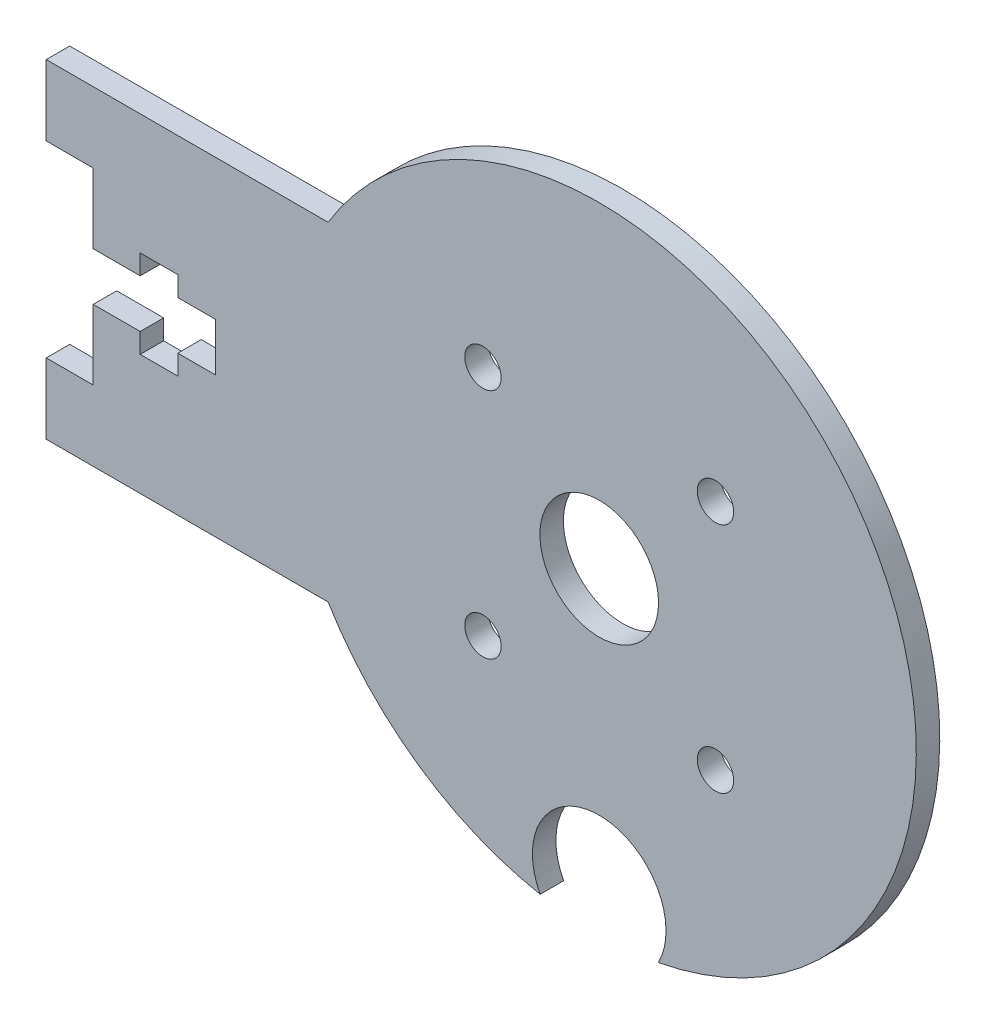
ISO-10303-21;
HEADER;
FILE_DESCRIPTION(('STEP AP214'),'2;1');
FILE_NAME('part.step','',(''),(''),'','','');
FILE_SCHEMA(('AUTOMOTIVE_DESIGN { 1 0 10303 214 1 1 1 1 }'));
ENDSEC;
DATA;
#1=APPLICATION_CONTEXT('core data for automotive mechanical design processes');
#2=APPLICATION_PROTOCOL_DEFINITION('international standard','automotive_design',2000,#1);
#3=PRODUCT_CONTEXT('',#1,'mechanical');
#4=PRODUCT('Part','Part','',(#3));
#5=PRODUCT_RELATED_PRODUCT_CATEGORY('part','',(#4));
#6=PRODUCT_DEFINITION_FORMATION('','',#4);
#7=PRODUCT_DEFINITION_CONTEXT('part definition',#1,'design');
#8=PRODUCT_DEFINITION('design','',#6,#7);
#9=PRODUCT_DEFINITION_SHAPE('','',#8);
#10=(LENGTH_UNIT() NAMED_UNIT(*) SI_UNIT(.MILLI.,.METRE.));
#11=(NAMED_UNIT(*) PLANE_ANGLE_UNIT() SI_UNIT($,.RADIAN.));
#12=(NAMED_UNIT(*) SI_UNIT($,.STERADIAN.) SOLID_ANGLE_UNIT());
#13=UNCERTAINTY_MEASURE_WITH_UNIT(LENGTH_MEASURE(1.E-05),#10,'distance_accuracy_value','');
#14=(GEOMETRIC_REPRESENTATION_CONTEXT(3) GLOBAL_UNCERTAINTY_ASSIGNED_CONTEXT((#13)) GLOBAL_UNIT_ASSIGNED_CONTEXT((#10,
#11,#12)) REPRESENTATION_CONTEXT('',''));
#15=CARTESIAN_POINT('',(0.,0.,0.));
#16=DIRECTION('',(0.,0.,1.));
#17=DIRECTION('',(1.,0.,0.));
#18=AXIS2_PLACEMENT_3D('',#15,#16,#17);
#19=CARTESIAN_POINT('',(0.,0.,2.));
#20=DIRECTION('',(0.,0.,1.));
#21=DIRECTION('',(1.,0.,0.));
#22=AXIS2_PLACEMENT_3D('',#19,#20,#21);
#23=PLANE('',#22);
#24=CARTESIAN_POINT('',(9.89949493661175,9.89949493661158,2.));
#25=DIRECTION('',(0.,0.,1.));
#26=DIRECTION('',(1.,0.,0.));
#27=AXIS2_PLACEMENT_3D('',#24,#25,#26);
#28=CIRCLE('',#27,1.55);
#29=CARTESIAN_POINT('',(11.4494949366117,9.89949493661158,2.));
#30=VERTEX_POINT('',#29);
#31=EDGE_CURVE('E428',#30,#30,#28,.T.);
#32=ORIENTED_EDGE('',*,*,#31,.F.);
#33=EDGE_LOOP('',(#32));
#34=FACE_BOUND('',#33,.T.);
#35=CARTESIAN_POINT('',(-9.89949493661168,-9.89949493661165,2.));
#36=DIRECTION('',(0.,0.,1.));
#37=DIRECTION('',(1.,0.,0.));
#38=AXIS2_PLACEMENT_3D('',#35,#36,#37);
#39=CIRCLE('',#38,1.55);
#40=CARTESIAN_POINT('',(-8.34949493661168,-9.89949493661165,2.));
#41=VERTEX_POINT('',#40);
#42=EDGE_CURVE('E440',#41,#41,#39,.T.);
#43=ORIENTED_EDGE('',*,*,#42,.F.);
#44=EDGE_LOOP('',(#43));
#45=FACE_BOUND('',#44,.T.);
#46=DIRECTION('',(1.,0.,0.));
#47=VECTOR('',#46,1.);
#48=CARTESIAN_POINT('',(-43.0867927612304,2.05,2.));
#49=LINE('',#48,#47);
#50=CARTESIAN_POINT('',(-43.0867927612304,2.05,2.));
#51=VERTEX_POINT('',#50);
#52=CARTESIAN_POINT('',(-39.0867927612304,2.05,2.));
#53=VERTEX_POINT('',#52);
#54=EDGE_CURVE('E261',#51,#53,#49,.T.);
#55=ORIENTED_EDGE('',*,*,#54,.T.);
#56=DIRECTION('',(0.,1.,0.));
#57=VECTOR('',#56,1.);
#58=CARTESIAN_POINT('',(-39.0867927612304,2.05,2.));
#59=LINE('',#58,#57);
#60=CARTESIAN_POINT('',(-39.0867927612304,3.74137062813604,2.));
#61=VERTEX_POINT('',#60);
#62=EDGE_CURVE('E137',#53,#61,#59,.T.);
#63=ORIENTED_EDGE('',*,*,#62,.T.);
#64=DIRECTION('',(1.,0.,0.));
#65=VECTOR('',#64,1.);
#66=CARTESIAN_POINT('',(-39.0867927612304,3.74137062813604,2.));
#67=LINE('',#66,#65);
#68=CARTESIAN_POINT('',(-35.8867927612304,3.74137062813604,2.));
#69=VERTEX_POINT('',#68);
#70=EDGE_CURVE('E318',#61,#69,#67,.T.);
#71=ORIENTED_EDGE('',*,*,#70,.T.);
#72=DIRECTION('',(0.,-1.,0.));
#73=VECTOR('',#72,1.);
#74=CARTESIAN_POINT('',(-35.8867927612304,3.74137062813604,2.));
#75=LINE('',#74,#73);
#76=CARTESIAN_POINT('',(-35.8867927612304,2.05,2.));
#77=VERTEX_POINT('',#76);
#78=EDGE_CURVE('E337',#69,#77,#75,.T.);
#79=ORIENTED_EDGE('',*,*,#78,.T.);
#80=DIRECTION('',(1.,0.,0.));
#81=VECTOR('',#80,1.);
#82=CARTESIAN_POINT('',(-35.8867927612304,2.05,2.));
#83=LINE('',#82,#81);
#84=CARTESIAN_POINT('',(-32.6867927612304,2.05000000000001,2.));
#85=VERTEX_POINT('',#84);
#86=EDGE_CURVE('E334',#77,#85,#83,.T.);
#87=ORIENTED_EDGE('',*,*,#86,.T.);
#88=DIRECTION('',(0.,-1.,0.));
#89=VECTOR('',#88,1.);
#90=CARTESIAN_POINT('',(-32.6867927612304,-2.05,2.));
#91=LINE('',#90,#89);
#92=CARTESIAN_POINT('',(-32.6867927612304,-2.05,2.));
#93=VERTEX_POINT('',#92);
#94=EDGE_CURVE('E336',#85,#93,#91,.T.);
#95=ORIENTED_EDGE('',*,*,#94,.T.);
#96=DIRECTION('',(-1.,0.,0.));
#97=VECTOR('',#96,1.);
#98=CARTESIAN_POINT('',(-35.8867927612304,-2.05,2.));
#99=LINE('',#98,#97);
#100=CARTESIAN_POINT('',(-35.8867927612304,-2.05,2.));
#101=VERTEX_POINT('',#100);
#102=EDGE_CURVE('E339',#93,#101,#99,.T.);
#103=ORIENTED_EDGE('',*,*,#102,.T.);
#104=DIRECTION('',(0.,-1.,0.));
#105=VECTOR('',#104,1.);
#106=CARTESIAN_POINT('',(-35.8867927612304,-3.74137062813604,2.));
#107=LINE('',#106,#105);
#108=CARTESIAN_POINT('',(-35.8867927612304,-3.74137062813604,2.));
#109=VERTEX_POINT('',#108);
#110=EDGE_CURVE('E345',#101,#109,#107,.T.);
#111=ORIENTED_EDGE('',*,*,#110,.T.);
#112=DIRECTION('',(-1.,0.,0.));
#113=VECTOR('',#112,1.);
#114=CARTESIAN_POINT('',(-39.0867927612304,-3.74137062813604,2.));
#115=LINE('',#114,#113);
#116=CARTESIAN_POINT('',(-39.0867927612304,-3.74137062813604,2.));
#117=VERTEX_POINT('',#116);
#118=EDGE_CURVE('E347',#109,#117,#115,.T.);
#119=ORIENTED_EDGE('',*,*,#118,.T.);
#120=DIRECTION('',(0.,1.,0.));
#121=VECTOR('',#120,1.);
#122=CARTESIAN_POINT('',(-39.0867927612304,-2.05,2.));
#123=LINE('',#122,#121);
#124=CARTESIAN_POINT('',(-39.0867927612304,-2.05,2.));
#125=VERTEX_POINT('',#124);
#126=EDGE_CURVE('E349',#117,#125,#123,.T.);
#127=ORIENTED_EDGE('',*,*,#126,.T.);
#128=DIRECTION('',(-1.,0.,0.));
#129=VECTOR('',#128,1.);
#130=CARTESIAN_POINT('',(-43.0867927612304,-2.05,2.));
#131=LINE('',#130,#129);
#132=CARTESIAN_POINT('',(-43.0867927612304,-2.05,2.));
#133=VERTEX_POINT('',#132);
#134=EDGE_CURVE('E351',#125,#133,#131,.T.);
#135=ORIENTED_EDGE('',*,*,#134,.T.);
#136=DIRECTION('',(0.,-1.,0.));
#137=VECTOR('',#136,1.);
#138=CARTESIAN_POINT('',(-43.0867927612304,-2.05,2.));
#139=LINE('',#138,#137);
#140=CARTESIAN_POINT('',(-43.0867927612304,-8.00000000000001,2.));
#141=VERTEX_POINT('',#140);
#142=EDGE_CURVE('E353',#133,#141,#139,.T.);
#143=ORIENTED_EDGE('',*,*,#142,.T.);
#144=DIRECTION('',(-1.,0.,0.));
#145=VECTOR('',#144,1.);
#146=CARTESIAN_POINT('',(-47.0867927612304,-8.00000000000001,2.));
#147=LINE('',#146,#145);
#148=CARTESIAN_POINT('',(-47.0867927612304,-8.00000000000001,2.));
#149=VERTEX_POINT('',#148);
#150=EDGE_CURVE('E355',#141,#149,#147,.T.);
#151=ORIENTED_EDGE('',*,*,#150,.T.);
#152=DIRECTION('',(0.,-1.,0.));
#153=VECTOR('',#152,1.);
#154=CARTESIAN_POINT('',(-47.0867927612304,-14.,2.));
#155=LINE('',#154,#153);
#156=CARTESIAN_POINT('',(-47.0867927612304,-14.,2.));
#157=VERTEX_POINT('',#156);
#158=EDGE_CURVE('E357',#149,#157,#155,.T.);
#159=ORIENTED_EDGE('',*,*,#158,.T.);
#160=DIRECTION('',(1.,0.,0.));
#161=VECTOR('',#160,1.);
#162=CARTESIAN_POINT('',(-43.0867927612304,-14.,2.));
#163=LINE('',#162,#161);
#164=CARTESIAN_POINT('',(-23.0867927612304,-14.,2.));
#165=VERTEX_POINT('',#164);
#166=EDGE_CURVE('E359',#157,#165,#163,.T.);
#167=ORIENTED_EDGE('',*,*,#166,.T.);
#168=CARTESIAN_POINT('',(0.,0.,2.));
#169=DIRECTION('',(0.,0.,1.));
#170=DIRECTION('',(1.,0.,0.));
#171=AXIS2_PLACEMENT_3D('',#168,#169,#170);
#172=CIRCLE('',#171,26.9999999999999);
#173=CARTESIAN_POINT('',(-5.02744915360052,-26.5278109727878,2.));
#174=VERTEX_POINT('',#173);
#175=EDGE_CURVE('E361',#165,#174,#172,.T.);
#176=ORIENTED_EDGE('',*,*,#175,.T.);
#177=CARTESIAN_POINT('',(0.,-23.8649464741611,2.));
#178=DIRECTION('',(0.,0.,-1.));
#179=DIRECTION('',(-1.,0.,0.));
#180=AXIS2_PLACEMENT_3D('',#177,#178,#179);
#181=CIRCLE('',#180,5.68912052342761);
#182=CARTESIAN_POINT('',(5.02744915360052,-26.5278109727878,2.));
#183=VERTEX_POINT('',#182);
#184=EDGE_CURVE('E363',#174,#183,#181,.T.);
#185=ORIENTED_EDGE('',*,*,#184,.T.);
#186=CARTESIAN_POINT('',(0.,0.,2.));
#187=DIRECTION('',(0.,0.,1.));
#188=DIRECTION('',(-1.,0.,0.));
#189=AXIS2_PLACEMENT_3D('',#186,#187,#188);
#190=CIRCLE('',#189,27.);
#191=CARTESIAN_POINT('',(-23.0867927612304,14.,2.));
#192=VERTEX_POINT('',#191);
#193=EDGE_CURVE('E365',#183,#192,#190,.T.);
#194=ORIENTED_EDGE('',*,*,#193,.T.);
#195=DIRECTION('',(-1.,0.,0.));
#196=VECTOR('',#195,1.);
#197=CARTESIAN_POINT('',(-23.0867927612304,14.,2.));
#198=LINE('',#197,#196);
#199=CARTESIAN_POINT('',(-47.0867927612304,14.,2.));
#200=VERTEX_POINT('',#199);
#201=EDGE_CURVE('E198',#192,#200,#198,.T.);
#202=ORIENTED_EDGE('',*,*,#201,.T.);
#203=DIRECTION('',(0.,-1.,0.));
#204=VECTOR('',#203,1.);
#205=CARTESIAN_POINT('',(-47.0867927612304,14.,2.));
#206=LINE('',#205,#204);
#207=CARTESIAN_POINT('',(-47.0867927612304,7.99999999999998,2.));
#208=VERTEX_POINT('',#207);
#209=EDGE_CURVE('E192',#200,#208,#206,.T.);
#210=ORIENTED_EDGE('',*,*,#209,.T.);
#211=DIRECTION('',(1.,0.,0.));
#212=VECTOR('',#211,1.);
#213=CARTESIAN_POINT('',(-47.0867927612304,7.99999999999998,2.));
#214=LINE('',#213,#212);
#215=CARTESIAN_POINT('',(-43.0867927612304,7.99999999999998,2.));
#216=VERTEX_POINT('',#215);
#217=EDGE_CURVE('E196',#208,#216,#214,.T.);
#218=ORIENTED_EDGE('',*,*,#217,.T.);
#219=DIRECTION('',(0.,-1.,0.));
#220=VECTOR('',#219,1.);
#221=CARTESIAN_POINT('',(-43.0867927612304,2.05,2.));
#222=LINE('',#221,#220);
#223=EDGE_CURVE('E52',#216,#51,#222,.T.);
#224=ORIENTED_EDGE('',*,*,#223,.T.);
#225=EDGE_LOOP('',(#55,#63,#71,#79,#87,#95,#103,#111,#119,#127,#135,#143,#151,#159,#167,#176,
#185,#194,#202,#210,#218,#224));
#226=FACE_BOUND('',#225,.T.);
#227=CARTESIAN_POINT('',(0.,0.,2.));
#228=DIRECTION('',(0.,0.,1.));
#229=DIRECTION('',(1.,0.,0.));
#230=AXIS2_PLACEMENT_3D('',#227,#228,#229);
#231=CIRCLE('',#230,5.05);
#232=CARTESIAN_POINT('',(5.05,0.,2.));
#233=VERTEX_POINT('',#232);
#234=EDGE_CURVE('E220',#233,#233,#231,.T.);
#235=ORIENTED_EDGE('',*,*,#234,.F.);
#236=EDGE_LOOP('',(#235));
#237=FACE_BOUND('',#236,.T.);
#238=CARTESIAN_POINT('',(-9.89949493661161,9.89949493661172,2.));
#239=DIRECTION('',(0.,0.,1.));
#240=DIRECTION('',(1.,0.,0.));
#241=AXIS2_PLACEMENT_3D('',#238,#239,#240);
#242=CIRCLE('',#241,1.55);
#243=CARTESIAN_POINT('',(-8.34949493661161,9.89949493661172,2.));
#244=VERTEX_POINT('',#243);
#245=EDGE_CURVE('E434',#244,#244,#242,.T.);
#246=ORIENTED_EDGE('',*,*,#245,.F.);
#247=EDGE_LOOP('',(#246));
#248=FACE_BOUND('',#247,.T.);
#249=CARTESIAN_POINT('',(9.89949493661154,-9.89949493661178,2.));
#250=DIRECTION('',(0.,0.,1.));
#251=DIRECTION('',(1.,0.,0.));
#252=AXIS2_PLACEMENT_3D('',#249,#250,#251);
#253=CIRCLE('',#252,1.55);
#254=CARTESIAN_POINT('',(11.4494949366115,-9.89949493661178,2.));
#255=VERTEX_POINT('',#254);
#256=EDGE_CURVE('E419',#255,#255,#253,.T.);
#257=ORIENTED_EDGE('',*,*,#256,.F.);
#258=EDGE_LOOP('',(#257));
#259=FACE_BOUND('',#258,.T.);
#260=ADVANCED_FACE('F35',(#34,#45,#226,#237,#248,#259),#23,.T.);
#261=CARTESIAN_POINT('',(0.,0.,0.));
#262=DIRECTION('',(0.,0.,1.));
#263=DIRECTION('',(1.,0.,0.));
#264=AXIS2_PLACEMENT_3D('',#261,#262,#263);
#265=PLANE('',#264);
#266=DIRECTION('',(1.,0.,0.));
#267=VECTOR('',#266,1.);
#268=CARTESIAN_POINT('',(-43.0867927612304,2.05,0.));
#269=LINE('',#268,#267);
#270=CARTESIAN_POINT('',(-43.0867927612304,2.05,0.));
#271=VERTEX_POINT('',#270);
#272=CARTESIAN_POINT('',(-39.0867927612304,2.05,0.));
#273=VERTEX_POINT('',#272);
#274=EDGE_CURVE('E216',#271,#273,#269,.T.);
#275=ORIENTED_EDGE('',*,*,#274,.F.);
#276=DIRECTION('',(0.,-1.,0.));
#277=VECTOR('',#276,1.);
#278=CARTESIAN_POINT('',(-43.0867927612304,2.05,0.));
#279=LINE('',#278,#277);
#280=CARTESIAN_POINT('',(-43.0867927612304,7.99999999999998,0.));
#281=VERTEX_POINT('',#280);
#282=EDGE_CURVE('E129',#281,#271,#279,.T.);
#283=ORIENTED_EDGE('',*,*,#282,.F.);
#284=DIRECTION('',(1.,0.,0.));
#285=VECTOR('',#284,1.);
#286=CARTESIAN_POINT('',(-47.0867927612304,7.99999999999998,0.));
#287=LINE('',#286,#285);
#288=CARTESIAN_POINT('',(-47.0867927612304,7.99999999999998,0.));
#289=VERTEX_POINT('',#288);
#290=EDGE_CURVE('E123',#289,#281,#287,.T.);
#291=ORIENTED_EDGE('',*,*,#290,.F.);
#292=DIRECTION('',(0.,-1.,0.));
#293=VECTOR('',#292,1.);
#294=CARTESIAN_POINT('',(-47.0867927612304,14.,0.));
#295=LINE('',#294,#293);
#296=CARTESIAN_POINT('',(-47.0867927612304,14.,0.));
#297=VERTEX_POINT('',#296);
#298=EDGE_CURVE('E206',#297,#289,#295,.T.);
#299=ORIENTED_EDGE('',*,*,#298,.F.);
#300=DIRECTION('',(-1.,0.,0.));
#301=VECTOR('',#300,1.);
#302=CARTESIAN_POINT('',(-43.0867927612304,14.,0.));
#303=LINE('',#302,#301);
#304=CARTESIAN_POINT('',(-23.0867927612304,14.,0.));
#305=VERTEX_POINT('',#304);
#306=EDGE_CURVE('E256',#305,#297,#303,.T.);
#307=ORIENTED_EDGE('',*,*,#306,.F.);
#308=CARTESIAN_POINT('',(0.,0.,0.));
#309=DIRECTION('',(0.,0.,1.));
#310=DIRECTION('',(-1.,0.,0.));
#311=AXIS2_PLACEMENT_3D('',#308,#309,#310);
#312=CIRCLE('',#311,27.);
#313=CARTESIAN_POINT('',(5.02744915360052,-26.5278109727878,0.));
#314=VERTEX_POINT('',#313);
#315=EDGE_CURVE('E253',#314,#305,#312,.T.);
#316=ORIENTED_EDGE('',*,*,#315,.F.);
#317=CARTESIAN_POINT('',(0.,-23.8649464741611,0.));
#318=DIRECTION('',(0.,0.,-1.));
#319=DIRECTION('',(-1.,0.,0.));
#320=AXIS2_PLACEMENT_3D('',#317,#318,#319);
#321=CIRCLE('',#320,5.68912052342761);
#322=CARTESIAN_POINT('',(-5.02744915360052,-26.5278109727878,0.));
#323=VERTEX_POINT('',#322);
#324=EDGE_CURVE('E251',#323,#314,#321,.T.);
#325=ORIENTED_EDGE('',*,*,#324,.F.);
#326=CARTESIAN_POINT('',(0.,0.,0.));
#327=DIRECTION('',(0.,0.,1.));
#328=DIRECTION('',(1.,0.,0.));
#329=AXIS2_PLACEMENT_3D('',#326,#327,#328);
#330=CIRCLE('',#329,26.9999999999999);
#331=CARTESIAN_POINT('',(-23.0867927612304,-14.,0.));
#332=VERTEX_POINT('',#331);
#333=EDGE_CURVE('E249',#332,#323,#330,.T.);
#334=ORIENTED_EDGE('',*,*,#333,.F.);
#335=DIRECTION('',(1.,0.,0.));
#336=VECTOR('',#335,1.);
#337=CARTESIAN_POINT('',(-23.0867927612304,-14.,0.));
#338=LINE('',#337,#336);
#339=CARTESIAN_POINT('',(-47.0867927612304,-14.,0.));
#340=VERTEX_POINT('',#339);
#341=EDGE_CURVE('E247',#340,#332,#338,.T.);
#342=ORIENTED_EDGE('',*,*,#341,.F.);
#343=DIRECTION('',(0.,-1.,0.));
#344=VECTOR('',#343,1.);
#345=CARTESIAN_POINT('',(-47.0867927612304,-14.,0.));
#346=LINE('',#345,#344);
#347=CARTESIAN_POINT('',(-47.0867927612304,-8.00000000000001,0.));
#348=VERTEX_POINT('',#347);
#349=EDGE_CURVE('E244',#348,#340,#346,.T.);
#350=ORIENTED_EDGE('',*,*,#349,.F.);
#351=DIRECTION('',(-1.,0.,0.));
#352=VECTOR('',#351,1.);
#353=CARTESIAN_POINT('',(-47.0867927612304,-8.00000000000001,0.));
#354=LINE('',#353,#352);
#355=CARTESIAN_POINT('',(-43.0867927612304,-8.00000000000001,0.));
#356=VERTEX_POINT('',#355);
#357=EDGE_CURVE('E242',#356,#348,#354,.T.);
#358=ORIENTED_EDGE('',*,*,#357,.F.);
#359=DIRECTION('',(0.,-1.,0.));
#360=VECTOR('',#359,1.);
#361=CARTESIAN_POINT('',(-43.0867927612304,-2.05,0.));
#362=LINE('',#361,#360);
#363=CARTESIAN_POINT('',(-43.0867927612304,-2.05,0.));
#364=VERTEX_POINT('',#363);
#365=EDGE_CURVE('E240',#364,#356,#362,.T.);
#366=ORIENTED_EDGE('',*,*,#365,.F.);
#367=DIRECTION('',(-1.,0.,0.));
#368=VECTOR('',#367,1.);
#369=CARTESIAN_POINT('',(-43.0867927612304,-2.05,0.));
#370=LINE('',#369,#368);
#371=CARTESIAN_POINT('',(-39.0867927612304,-2.05,0.));
#372=VERTEX_POINT('',#371);
#373=EDGE_CURVE('E238',#372,#364,#370,.T.);
#374=ORIENTED_EDGE('',*,*,#373,.F.);
#375=DIRECTION('',(0.,1.,0.));
#376=VECTOR('',#375,1.);
#377=CARTESIAN_POINT('',(-39.0867927612304,-2.05,0.));
#378=LINE('',#377,#376);
#379=CARTESIAN_POINT('',(-39.0867927612304,-3.74137062813604,0.));
#380=VERTEX_POINT('',#379);
#381=EDGE_CURVE('E236',#380,#372,#378,.T.);
#382=ORIENTED_EDGE('',*,*,#381,.F.);
#383=DIRECTION('',(-1.,0.,0.));
#384=VECTOR('',#383,1.);
#385=CARTESIAN_POINT('',(-39.0867927612304,-3.74137062813604,0.));
#386=LINE('',#385,#384);
#387=CARTESIAN_POINT('',(-35.8867927612304,-3.74137062813604,0.));
#388=VERTEX_POINT('',#387);
#389=EDGE_CURVE('E234',#388,#380,#386,.T.);
#390=ORIENTED_EDGE('',*,*,#389,.F.);
#391=DIRECTION('',(0.,-1.,0.));
#392=VECTOR('',#391,1.);
#393=CARTESIAN_POINT('',(-35.8867927612304,-3.74137062813604,0.));
#394=LINE('',#393,#392);
#395=CARTESIAN_POINT('',(-35.8867927612304,-2.05,0.));
#396=VERTEX_POINT('',#395);
#397=EDGE_CURVE('E232',#396,#388,#394,.T.);
#398=ORIENTED_EDGE('',*,*,#397,.F.);
#399=DIRECTION('',(-1.,0.,0.));
#400=VECTOR('',#399,1.);
#401=CARTESIAN_POINT('',(-35.8867927612304,-2.05,0.));
#402=LINE('',#401,#400);
#403=CARTESIAN_POINT('',(-32.6867927612304,-2.05,0.));
#404=VERTEX_POINT('',#403);
#405=EDGE_CURVE('E230',#404,#396,#402,.T.);
#406=ORIENTED_EDGE('',*,*,#405,.F.);
#407=DIRECTION('',(0.,-1.,0.));
#408=VECTOR('',#407,1.);
#409=CARTESIAN_POINT('',(-32.6867927612304,-2.05,0.));
#410=LINE('',#409,#408);
#411=CARTESIAN_POINT('',(-32.6867927612304,2.05000000000001,0.));
#412=VERTEX_POINT('',#411);
#413=EDGE_CURVE('E228',#412,#404,#410,.T.);
#414=ORIENTED_EDGE('',*,*,#413,.F.);
#415=DIRECTION('',(1.,0.,0.));
#416=VECTOR('',#415,1.);
#417=CARTESIAN_POINT('',(-35.8867927612304,2.05,0.));
#418=LINE('',#417,#416);
#419=CARTESIAN_POINT('',(-35.8867927612304,2.05,0.));
#420=VERTEX_POINT('',#419);
#421=EDGE_CURVE('E226',#420,#412,#418,.T.);
#422=ORIENTED_EDGE('',*,*,#421,.F.);
#423=DIRECTION('',(0.,-1.,0.));
#424=VECTOR('',#423,1.);
#425=CARTESIAN_POINT('',(-35.8867927612304,3.74137062813604,0.));
#426=LINE('',#425,#424);
#427=CARTESIAN_POINT('',(-35.8867927612304,3.74137062813604,0.));
#428=VERTEX_POINT('',#427);
#429=EDGE_CURVE('E224',#428,#420,#426,.T.);
#430=ORIENTED_EDGE('',*,*,#429,.F.);
#431=DIRECTION('',(1.,0.,0.));
#432=VECTOR('',#431,1.);
#433=CARTESIAN_POINT('',(-39.0867927612304,3.74137062813604,0.));
#434=LINE('',#433,#432);
#435=CARTESIAN_POINT('',(-39.0867927612304,3.74137062813604,0.));
#436=VERTEX_POINT('',#435);
#437=EDGE_CURVE('E222',#436,#428,#434,.T.);
#438=ORIENTED_EDGE('',*,*,#437,.F.);
#439=DIRECTION('',(0.,1.,0.));
#440=VECTOR('',#439,1.);
#441=CARTESIAN_POINT('',(-39.0867927612304,2.05,0.));
#442=LINE('',#441,#440);
#443=EDGE_CURVE('E219',#273,#436,#442,.T.);
#444=ORIENTED_EDGE('',*,*,#443,.F.);
#445=EDGE_LOOP('',(#275,#283,#291,#299,#307,#316,#325,#334,#342,#350,#358,#366,#374,#382,#390,
#398,#406,#414,#422,#430,#438,#444));
#446=FACE_BOUND('',#445,.T.);
#447=CARTESIAN_POINT('',(0.,0.,0.));
#448=DIRECTION('',(0.,0.,1.));
#449=DIRECTION('',(1.,0.,0.));
#450=AXIS2_PLACEMENT_3D('',#447,#448,#449);
#451=CIRCLE('',#450,5.05);
#452=CARTESIAN_POINT('',(5.05,0.,0.));
#453=VERTEX_POINT('',#452);
#454=EDGE_CURVE('E443',#453,#453,#451,.T.);
#455=ORIENTED_EDGE('',*,*,#454,.T.);
#456=EDGE_LOOP('',(#455));
#457=FACE_BOUND('',#456,.T.);
#458=CARTESIAN_POINT('',(-9.89949493661168,-9.89949493661165,0.));
#459=DIRECTION('',(0.,0.,1.));
#460=DIRECTION('',(1.,0.,0.));
#461=AXIS2_PLACEMENT_3D('',#458,#459,#460);
#462=CIRCLE('',#461,1.55);
#463=CARTESIAN_POINT('',(-8.34949493661168,-9.89949493661165,0.));
#464=VERTEX_POINT('',#463);
#465=EDGE_CURVE('E437',#464,#464,#462,.T.);
#466=ORIENTED_EDGE('',*,*,#465,.T.);
#467=EDGE_LOOP('',(#466));
#468=FACE_BOUND('',#467,.T.);
#469=CARTESIAN_POINT('',(-9.89949493661161,9.89949493661172,0.));
#470=DIRECTION('',(0.,0.,1.));
#471=DIRECTION('',(1.,0.,0.));
#472=AXIS2_PLACEMENT_3D('',#469,#470,#471);
#473=CIRCLE('',#472,1.55);
#474=CARTESIAN_POINT('',(-8.34949493661161,9.89949493661172,0.));
#475=VERTEX_POINT('',#474);
#476=EDGE_CURVE('E431',#475,#475,#473,.T.);
#477=ORIENTED_EDGE('',*,*,#476,.T.);
#478=EDGE_LOOP('',(#477));
#479=FACE_BOUND('',#478,.T.);
#480=CARTESIAN_POINT('',(9.89949493661175,9.89949493661158,0.));
#481=DIRECTION('',(0.,0.,1.));
#482=DIRECTION('',(1.,0.,0.));
#483=AXIS2_PLACEMENT_3D('',#480,#481,#482);
#484=CIRCLE('',#483,1.55);
#485=CARTESIAN_POINT('',(11.4494949366117,9.89949493661158,0.));
#486=VERTEX_POINT('',#485);
#487=EDGE_CURVE('E425',#486,#486,#484,.T.);
#488=ORIENTED_EDGE('',*,*,#487,.T.);
#489=EDGE_LOOP('',(#488));
#490=FACE_BOUND('',#489,.T.);
#491=CARTESIAN_POINT('',(9.89949493661154,-9.89949493661178,0.));
#492=DIRECTION('',(0.,0.,1.));
#493=DIRECTION('',(1.,0.,0.));
#494=AXIS2_PLACEMENT_3D('',#491,#492,#493);
#495=CIRCLE('',#494,1.55);
#496=CARTESIAN_POINT('',(11.4494949366115,-9.89949493661178,0.));
#497=VERTEX_POINT('',#496);
#498=EDGE_CURVE('E422',#497,#497,#495,.T.);
#499=ORIENTED_EDGE('',*,*,#498,.T.);
#500=EDGE_LOOP('',(#499));
#501=FACE_BOUND('',#500,.T.);
#502=ADVANCED_FACE('F322',(#446,#457,#468,#479,#490,#501),#265,.F.);
#503=CARTESIAN_POINT('',(-43.0867927612304,2.05,2.));
#504=DIRECTION('',(0.,1.,0.));
#505=DIRECTION('',(-1.,0.,0.));
#506=AXIS2_PLACEMENT_3D('',#503,#504,#505);
#507=PLANE('',#506);
#508=ORIENTED_EDGE('',*,*,#274,.T.);
#509=DIRECTION('',(0.,0.,-1.));
#510=VECTOR('',#509,1.);
#511=CARTESIAN_POINT('',(-39.0867927612304,2.05,2.));
#512=LINE('',#511,#510);
#513=EDGE_CURVE('E11',#53,#273,#512,.T.);
#514=ORIENTED_EDGE('',*,*,#513,.F.);
#515=ORIENTED_EDGE('',*,*,#54,.F.);
#516=DIRECTION('',(0.,0.,-1.));
#517=VECTOR('',#516,1.);
#518=CARTESIAN_POINT('',(-43.0867927612304,2.05,2.));
#519=LINE('',#518,#517);
#520=EDGE_CURVE('E212',#51,#271,#519,.T.);
#521=ORIENTED_EDGE('',*,*,#520,.T.);
#522=EDGE_LOOP('',(#508,#514,#515,#521));
#523=FACE_BOUND('',#522,.T.);
#524=ADVANCED_FACE('F37',(#523),#507,.F.);
#525=CARTESIAN_POINT('',(-39.0867927612304,2.05,2.));
#526=DIRECTION('',(-1.,0.,0.));
#527=DIRECTION('',(0.,0.,1.));
#528=AXIS2_PLACEMENT_3D('',#525,#526,#527);
#529=PLANE('',#528);
#530=ORIENTED_EDGE('',*,*,#443,.T.);
#531=DIRECTION('',(0.,0.,-1.));
#532=VECTOR('',#531,1.);
#533=CARTESIAN_POINT('',(-39.0867927612304,3.74137062813604,2.));
#534=LINE('',#533,#532);
#535=EDGE_CURVE('E44',#61,#436,#534,.T.);
#536=ORIENTED_EDGE('',*,*,#535,.F.);
#537=ORIENTED_EDGE('',*,*,#62,.F.);
#538=ORIENTED_EDGE('',*,*,#513,.T.);
#539=EDGE_LOOP('',(#530,#536,#537,#538));
#540=FACE_BOUND('',#539,.T.);
#541=ADVANCED_FACE('F664',(#540),#529,.F.);
#542=CARTESIAN_POINT('',(-39.0867927612304,3.74137062813604,2.));
#543=DIRECTION('',(0.,1.,0.));
#544=DIRECTION('',(-1.,0.,0.));
#545=AXIS2_PLACEMENT_3D('',#542,#543,#544);
#546=PLANE('',#545);
#547=ORIENTED_EDGE('',*,*,#437,.T.);
#548=DIRECTION('',(0.,0.,-1.));
#549=VECTOR('',#548,1.);
#550=CARTESIAN_POINT('',(-35.8867927612304,3.74137062813604,2.));
#551=LINE('',#550,#549);
#552=EDGE_CURVE('E310',#69,#428,#551,.T.);
#553=ORIENTED_EDGE('',*,*,#552,.F.);
#554=ORIENTED_EDGE('',*,*,#70,.F.);
#555=ORIENTED_EDGE('',*,*,#535,.T.);
#556=EDGE_LOOP('',(#547,#553,#554,#555));
#557=FACE_BOUND('',#556,.T.);
#558=ADVANCED_FACE('F316',(#557),#546,.F.);
#559=CARTESIAN_POINT('',(-35.8867927612304,3.74137062813604,2.));
#560=DIRECTION('',(1.,0.,0.));
#561=DIRECTION('',(0.,0.,-1.));
#562=AXIS2_PLACEMENT_3D('',#559,#560,#561);
#563=PLANE('',#562);
#564=ORIENTED_EDGE('',*,*,#429,.T.);
#565=DIRECTION('',(0.,0.,-1.));
#566=VECTOR('',#565,1.);
#567=CARTESIAN_POINT('',(-35.8867927612304,2.05,2.));
#568=LINE('',#567,#566);
#569=EDGE_CURVE('E307',#77,#420,#568,.T.);
#570=ORIENTED_EDGE('',*,*,#569,.F.);
#571=ORIENTED_EDGE('',*,*,#78,.F.);
#572=ORIENTED_EDGE('',*,*,#552,.T.);
#573=EDGE_LOOP('',(#564,#570,#571,#572));
#574=FACE_BOUND('',#573,.T.);
#575=ADVANCED_FACE('F328',(#574),#563,.F.);
#576=CARTESIAN_POINT('',(-35.8867927612304,2.05,2.));
#577=DIRECTION('',(0.,1.,0.));
#578=DIRECTION('',(-1.,0.,0.));
#579=AXIS2_PLACEMENT_3D('',#576,#577,#578);
#580=PLANE('',#579);
#581=ORIENTED_EDGE('',*,*,#421,.T.);
#582=DIRECTION('',(0.,0.,-1.));
#583=VECTOR('',#582,1.);
#584=CARTESIAN_POINT('',(-32.6867927612304,2.05000000000001,2.));
#585=LINE('',#584,#583);
#586=EDGE_CURVE('E304',#85,#412,#585,.T.);
#587=ORIENTED_EDGE('',*,*,#586,.F.);
#588=ORIENTED_EDGE('',*,*,#86,.F.);
#589=ORIENTED_EDGE('',*,*,#569,.T.);
#590=EDGE_LOOP('',(#581,#587,#588,#589));
#591=FACE_BOUND('',#590,.T.);
#592=ADVANCED_FACE('F332',(#591),#580,.F.);
#593=CARTESIAN_POINT('',(-32.6867927612304,-2.05,2.));
#594=DIRECTION('',(1.,0.,0.));
#595=DIRECTION('',(0.,0.,-1.));
#596=AXIS2_PLACEMENT_3D('',#593,#594,#595);
#597=PLANE('',#596);
#598=ORIENTED_EDGE('',*,*,#413,.T.);
#599=DIRECTION('',(0.,0.,-1.));
#600=VECTOR('',#599,1.);
#601=CARTESIAN_POINT('',(-32.6867927612304,-2.05,2.));
#602=LINE('',#601,#600);
#603=EDGE_CURVE('E301',#93,#404,#602,.T.);
#604=ORIENTED_EDGE('',*,*,#603,.F.);
#605=ORIENTED_EDGE('',*,*,#94,.F.);
#606=ORIENTED_EDGE('',*,*,#586,.T.);
#607=EDGE_LOOP('',(#598,#604,#605,#606));
#608=FACE_BOUND('',#607,.T.);
#609=ADVANCED_FACE('F629',(#608),#597,.F.);
#610=CARTESIAN_POINT('',(-35.8867927612304,-2.05,2.));
#611=DIRECTION('',(0.,-1.,0.));
#612=DIRECTION('',(0.,0.,-1.));
#613=AXIS2_PLACEMENT_3D('',#610,#611,#612);
#614=PLANE('',#613);
#615=ORIENTED_EDGE('',*,*,#405,.T.);
#616=DIRECTION('',(0.,0.,-1.));
#617=VECTOR('',#616,1.);
#618=CARTESIAN_POINT('',(-35.8867927612304,-2.05,2.));
#619=LINE('',#618,#617);
#620=EDGE_CURVE('E298',#101,#396,#619,.T.);
#621=ORIENTED_EDGE('',*,*,#620,.F.);
#622=ORIENTED_EDGE('',*,*,#102,.F.);
#623=ORIENTED_EDGE('',*,*,#603,.T.);
#624=EDGE_LOOP('',(#615,#621,#622,#623));
#625=FACE_BOUND('',#624,.T.);
#626=ADVANCED_FACE('F619',(#625),#614,.F.);
#627=CARTESIAN_POINT('',(-35.8867927612304,-3.74137062813604,2.));
#628=DIRECTION('',(1.,0.,0.));
#629=DIRECTION('',(0.,0.,-1.));
#630=AXIS2_PLACEMENT_3D('',#627,#628,#629);
#631=PLANE('',#630);
#632=ORIENTED_EDGE('',*,*,#397,.T.);
#633=DIRECTION('',(0.,0.,-1.));
#634=VECTOR('',#633,1.);
#635=CARTESIAN_POINT('',(-35.8867927612304,-3.74137062813604,2.));
#636=LINE('',#635,#634);
#637=EDGE_CURVE('E295',#109,#388,#636,.T.);
#638=ORIENTED_EDGE('',*,*,#637,.F.);
#639=ORIENTED_EDGE('',*,*,#110,.F.);
#640=ORIENTED_EDGE('',*,*,#620,.T.);
#641=EDGE_LOOP('',(#632,#638,#639,#640));
#642=FACE_BOUND('',#641,.T.);
#643=ADVANCED_FACE('F609',(#642),#631,.F.);
#644=CARTESIAN_POINT('',(-39.0867927612304,-3.74137062813604,2.));
#645=DIRECTION('',(0.,-1.,0.));
#646=DIRECTION('',(0.,0.,-1.));
#647=AXIS2_PLACEMENT_3D('',#644,#645,#646);
#648=PLANE('',#647);
#649=ORIENTED_EDGE('',*,*,#389,.T.);
#650=DIRECTION('',(0.,0.,-1.));
#651=VECTOR('',#650,1.);
#652=CARTESIAN_POINT('',(-39.0867927612304,-3.74137062813604,2.));
#653=LINE('',#652,#651);
#654=EDGE_CURVE('E292',#117,#380,#653,.T.);
#655=ORIENTED_EDGE('',*,*,#654,.F.);
#656=ORIENTED_EDGE('',*,*,#118,.F.);
#657=ORIENTED_EDGE('',*,*,#637,.T.);
#658=EDGE_LOOP('',(#649,#655,#656,#657));
#659=FACE_BOUND('',#658,.T.);
#660=ADVANCED_FACE('F599',(#659),#648,.F.);
#661=CARTESIAN_POINT('',(-39.0867927612304,-2.05,2.));
#662=DIRECTION('',(-1.,0.,0.));
#663=DIRECTION('',(0.,0.,1.));
#664=AXIS2_PLACEMENT_3D('',#661,#662,#663);
#665=PLANE('',#664);
#666=ORIENTED_EDGE('',*,*,#381,.T.);
#667=DIRECTION('',(0.,0.,-1.));
#668=VECTOR('',#667,1.);
#669=CARTESIAN_POINT('',(-39.0867927612304,-2.05,2.));
#670=LINE('',#669,#668);
#671=EDGE_CURVE('E289',#125,#372,#670,.T.);
#672=ORIENTED_EDGE('',*,*,#671,.F.);
#673=ORIENTED_EDGE('',*,*,#126,.F.);
#674=ORIENTED_EDGE('',*,*,#654,.T.);
#675=EDGE_LOOP('',(#666,#672,#673,#674));
#676=FACE_BOUND('',#675,.T.);
#677=ADVANCED_FACE('F589',(#676),#665,.F.);
#678=CARTESIAN_POINT('',(-43.0867927612304,-2.05,2.));
#679=DIRECTION('',(0.,-1.,0.));
#680=DIRECTION('',(1.,0.,0.));
#681=AXIS2_PLACEMENT_3D('',#678,#679,#680);
#682=PLANE('',#681);
#683=ORIENTED_EDGE('',*,*,#373,.T.);
#684=DIRECTION('',(0.,0.,-1.));
#685=VECTOR('',#684,1.);
#686=CARTESIAN_POINT('',(-43.0867927612304,-2.05,2.));
#687=LINE('',#686,#685);
#688=EDGE_CURVE('E286',#133,#364,#687,.T.);
#689=ORIENTED_EDGE('',*,*,#688,.F.);
#690=ORIENTED_EDGE('',*,*,#134,.F.);
#691=ORIENTED_EDGE('',*,*,#671,.T.);
#692=EDGE_LOOP('',(#683,#689,#690,#691));
#693=FACE_BOUND('',#692,.T.);
#694=ADVANCED_FACE('F579',(#693),#682,.F.);
#695=CARTESIAN_POINT('',(-43.0867927612304,-2.05,2.));
#696=DIRECTION('',(1.,0.,0.));
#697=DIRECTION('',(0.,0.,-1.));
#698=AXIS2_PLACEMENT_3D('',#695,#696,#697);
#699=PLANE('',#698);
#700=ORIENTED_EDGE('',*,*,#365,.T.);
#701=DIRECTION('',(0.,0.,-1.));
#702=VECTOR('',#701,1.);
#703=CARTESIAN_POINT('',(-43.0867927612304,-8.00000000000001,2.));
#704=LINE('',#703,#702);
#705=EDGE_CURVE('E283',#141,#356,#704,.T.);
#706=ORIENTED_EDGE('',*,*,#705,.F.);
#707=ORIENTED_EDGE('',*,*,#142,.F.);
#708=ORIENTED_EDGE('',*,*,#688,.T.);
#709=EDGE_LOOP('',(#700,#706,#707,#708));
#710=FACE_BOUND('',#709,.T.);
#711=ADVANCED_FACE('F569',(#710),#699,.F.);
#712=CARTESIAN_POINT('',(-47.0867927612304,-8.00000000000001,2.));
#713=DIRECTION('',(0.,-1.,0.));
#714=DIRECTION('',(0.,0.,-1.));
#715=AXIS2_PLACEMENT_3D('',#712,#713,#714);
#716=PLANE('',#715);
#717=ORIENTED_EDGE('',*,*,#357,.T.);
#718=DIRECTION('',(0.,0.,-1.));
#719=VECTOR('',#718,1.);
#720=CARTESIAN_POINT('',(-47.0867927612304,-8.00000000000001,2.));
#721=LINE('',#720,#719);
#722=EDGE_CURVE('E280',#149,#348,#721,.T.);
#723=ORIENTED_EDGE('',*,*,#722,.F.);
#724=ORIENTED_EDGE('',*,*,#150,.F.);
#725=ORIENTED_EDGE('',*,*,#705,.T.);
#726=EDGE_LOOP('',(#717,#723,#724,#725));
#727=FACE_BOUND('',#726,.T.);
#728=ADVANCED_FACE('F559',(#727),#716,.F.);
#729=CARTESIAN_POINT('',(-47.0867927612304,-14.,2.));
#730=DIRECTION('',(1.,0.,0.));
#731=DIRECTION('',(0.,0.,-1.));
#732=AXIS2_PLACEMENT_3D('',#729,#730,#731);
#733=PLANE('',#732);
#734=ORIENTED_EDGE('',*,*,#349,.T.);
#735=DIRECTION('',(0.,0.,-1.));
#736=VECTOR('',#735,1.);
#737=CARTESIAN_POINT('',(-47.0867927612304,-14.,2.));
#738=LINE('',#737,#736);
#739=EDGE_CURVE('E277',#157,#340,#738,.T.);
#740=ORIENTED_EDGE('',*,*,#739,.F.);
#741=ORIENTED_EDGE('',*,*,#158,.F.);
#742=ORIENTED_EDGE('',*,*,#722,.T.);
#743=EDGE_LOOP('',(#734,#740,#741,#742));
#744=FACE_BOUND('',#743,.T.);
#745=ADVANCED_FACE('F548',(#744),#733,.F.);
#746=CARTESIAN_POINT('',(-23.0867927612304,-14.,2.));
#747=DIRECTION('',(0.,1.,0.));
#748=DIRECTION('',(-1.,0.,0.));
#749=AXIS2_PLACEMENT_3D('',#746,#747,#748);
#750=PLANE('',#749);
#751=ORIENTED_EDGE('',*,*,#341,.T.);
#752=DIRECTION('',(0.,0.,-1.));
#753=VECTOR('',#752,1.);
#754=CARTESIAN_POINT('',(-23.0867927612304,-14.,2.));
#755=LINE('',#754,#753);
#756=EDGE_CURVE('E274',#165,#332,#755,.T.);
#757=ORIENTED_EDGE('',*,*,#756,.F.);
#758=ORIENTED_EDGE('',*,*,#166,.F.);
#759=ORIENTED_EDGE('',*,*,#739,.T.);
#760=EDGE_LOOP('',(#751,#757,#758,#759));
#761=FACE_BOUND('',#760,.T.);
#762=ADVANCED_FACE('F538',(#761),#750,.F.);
#763=CARTESIAN_POINT('',(0.,0.,2.));
#764=DIRECTION('',(0.,0.,-1.));
#765=DIRECTION('',(-1.,0.,0.));
#766=AXIS2_PLACEMENT_3D('',#763,#764,#765);
#767=CYLINDRICAL_SURFACE('',#766,26.9999999999999);
#768=ORIENTED_EDGE('',*,*,#333,.T.);
#769=DIRECTION('',(0.,0.,-1.));
#770=VECTOR('',#769,1.);
#771=CARTESIAN_POINT('',(-5.02744915360052,-26.5278109727878,2.));
#772=LINE('',#771,#770);
#773=EDGE_CURVE('E271',#174,#323,#772,.T.);
#774=ORIENTED_EDGE('',*,*,#773,.F.);
#775=ORIENTED_EDGE('',*,*,#175,.F.);
#776=ORIENTED_EDGE('',*,*,#756,.T.);
#777=EDGE_LOOP('',(#768,#774,#775,#776));
#778=FACE_BOUND('',#777,.T.);
#779=ADVANCED_FACE('F528',(#778),#767,.T.);
#780=CARTESIAN_POINT('',(0.,-23.8649464741611,2.));
#781=DIRECTION('',(0.,0.,-1.));
#782=DIRECTION('',(-1.,0.,0.));
#783=AXIS2_PLACEMENT_3D('',#780,#781,#782);
#784=CYLINDRICAL_SURFACE('',#783,5.68912052342761);
#785=ORIENTED_EDGE('',*,*,#324,.T.);
#786=DIRECTION('',(0.,0.,-1.));
#787=VECTOR('',#786,1.);
#788=CARTESIAN_POINT('',(5.02744915360052,-26.5278109727878,2.));
#789=LINE('',#788,#787);
#790=EDGE_CURVE('E268',#183,#314,#789,.T.);
#791=ORIENTED_EDGE('',*,*,#790,.F.);
#792=ORIENTED_EDGE('',*,*,#184,.F.);
#793=ORIENTED_EDGE('',*,*,#773,.T.);
#794=EDGE_LOOP('',(#785,#791,#792,#793));
#795=FACE_BOUND('',#794,.T.);
#796=ADVANCED_FACE('F519',(#795),#784,.F.);
#797=CARTESIAN_POINT('',(0.,0.,2.));
#798=DIRECTION('',(0.,0.,-1.));
#799=DIRECTION('',(-1.,0.,0.));
#800=AXIS2_PLACEMENT_3D('',#797,#798,#799);
#801=CYLINDRICAL_SURFACE('',#800,27.);
#802=ORIENTED_EDGE('',*,*,#315,.T.);
#803=DIRECTION('',(0.,0.,-1.));
#804=VECTOR('',#803,1.);
#805=CARTESIAN_POINT('',(-23.0867927612304,14.,2.));
#806=LINE('',#805,#804);
#807=EDGE_CURVE('E265',#192,#305,#806,.T.);
#808=ORIENTED_EDGE('',*,*,#807,.F.);
#809=ORIENTED_EDGE('',*,*,#193,.F.);
#810=ORIENTED_EDGE('',*,*,#790,.T.);
#811=EDGE_LOOP('',(#802,#808,#809,#810));
#812=FACE_BOUND('',#811,.T.);
#813=ADVANCED_FACE('F371',(#812),#801,.T.);
#814=CARTESIAN_POINT('',(-43.0867927612304,14.,2.));
#815=DIRECTION('',(0.,-1.,0.));
#816=DIRECTION('',(1.,0.,0.));
#817=AXIS2_PLACEMENT_3D('',#814,#815,#816);
#818=PLANE('',#817);
#819=ORIENTED_EDGE('',*,*,#306,.T.);
#820=DIRECTION('',(0.,0.,-1.));
#821=VECTOR('',#820,1.);
#822=CARTESIAN_POINT('',(-47.0867927612304,14.,2.));
#823=LINE('',#822,#821);
#824=EDGE_CURVE('E207',#200,#297,#823,.T.);
#825=ORIENTED_EDGE('',*,*,#824,.F.);
#826=ORIENTED_EDGE('',*,*,#201,.F.);
#827=ORIENTED_EDGE('',*,*,#807,.T.);
#828=EDGE_LOOP('',(#819,#825,#826,#827));
#829=FACE_BOUND('',#828,.T.);
#830=ADVANCED_FACE('F374',(#829),#818,.F.);
#831=CARTESIAN_POINT('',(-47.0867927612304,14.,2.));
#832=DIRECTION('',(1.,0.,0.));
#833=DIRECTION('',(0.,0.,-1.));
#834=AXIS2_PLACEMENT_3D('',#831,#832,#833);
#835=PLANE('',#834);
#836=ORIENTED_EDGE('',*,*,#298,.T.);
#837=DIRECTION('',(0.,0.,-1.));
#838=VECTOR('',#837,1.);
#839=CARTESIAN_POINT('',(-47.0867927612304,7.99999999999998,2.));
#840=LINE('',#839,#838);
#841=EDGE_CURVE('E203',#208,#289,#840,.T.);
#842=ORIENTED_EDGE('',*,*,#841,.F.);
#843=ORIENTED_EDGE('',*,*,#209,.F.);
#844=ORIENTED_EDGE('',*,*,#824,.T.);
#845=EDGE_LOOP('',(#836,#842,#843,#844));
#846=FACE_BOUND('',#845,.T.);
#847=ADVANCED_FACE('F204',(#846),#835,.F.);
#848=CARTESIAN_POINT('',(-47.0867927612304,7.99999999999998,2.));
#849=DIRECTION('',(0.,1.,0.));
#850=DIRECTION('',(0.,0.,1.));
#851=AXIS2_PLACEMENT_3D('',#848,#849,#850);
#852=PLANE('',#851);
#853=ORIENTED_EDGE('',*,*,#290,.T.);
#854=DIRECTION('',(0.,0.,-1.));
#855=VECTOR('',#854,1.);
#856=CARTESIAN_POINT('',(-43.0867927612304,7.99999999999998,2.));
#857=LINE('',#856,#855);
#858=EDGE_CURVE('E208',#216,#281,#857,.T.);
#859=ORIENTED_EDGE('',*,*,#858,.F.);
#860=ORIENTED_EDGE('',*,*,#217,.F.);
#861=ORIENTED_EDGE('',*,*,#841,.T.);
#862=EDGE_LOOP('',(#853,#859,#860,#861));
#863=FACE_BOUND('',#862,.T.);
#864=ADVANCED_FACE('F210',(#863),#852,.F.);
#865=CARTESIAN_POINT('',(-43.0867927612304,2.05,2.));
#866=DIRECTION('',(1.,0.,0.));
#867=DIRECTION('',(0.,1.,0.));
#868=AXIS2_PLACEMENT_3D('',#865,#866,#867);
#869=PLANE('',#868);
#870=ORIENTED_EDGE('',*,*,#282,.T.);
#871=ORIENTED_EDGE('',*,*,#520,.F.);
#872=ORIENTED_EDGE('',*,*,#223,.F.);
#873=ORIENTED_EDGE('',*,*,#858,.T.);
#874=EDGE_LOOP('',(#870,#871,#872,#873));
#875=FACE_BOUND('',#874,.T.);
#876=ADVANCED_FACE('F378',(#875),#869,.F.);
#877=CARTESIAN_POINT('',(0.,0.,2.));
#878=DIRECTION('',(0.,0.,-1.));
#879=DIRECTION('',(-1.,0.,0.));
#880=AXIS2_PLACEMENT_3D('',#877,#878,#879);
#881=CYLINDRICAL_SURFACE('',#880,5.05);
#882=ORIENTED_EDGE('',*,*,#234,.T.);
#883=EDGE_LOOP('',(#882));
#884=FACE_BOUND('',#883,.T.);
#885=ORIENTED_EDGE('',*,*,#454,.F.);
#886=EDGE_LOOP('',(#885));
#887=FACE_BOUND('',#886,.T.);
#888=ADVANCED_FACE('F380',(#884,#887),#881,.F.);
#889=CARTESIAN_POINT('',(-9.89949493661168,-9.89949493661165,2.));
#890=DIRECTION('',(0.,0.,-1.));
#891=DIRECTION('',(-1.,0.,0.));
#892=AXIS2_PLACEMENT_3D('',#889,#890,#891);
#893=CYLINDRICAL_SURFACE('',#892,1.55);
#894=ORIENTED_EDGE('',*,*,#42,.T.);
#895=EDGE_LOOP('',(#894));
#896=FACE_BOUND('',#895,.T.);
#897=ORIENTED_EDGE('',*,*,#465,.F.);
#898=EDGE_LOOP('',(#897));
#899=FACE_BOUND('',#898,.T.);
#900=ADVANCED_FACE('F386',(#896,#899),#893,.F.);
#901=CARTESIAN_POINT('',(-9.89949493661161,9.89949493661172,2.));
#902=DIRECTION('',(0.,0.,-1.));
#903=DIRECTION('',(-1.,0.,0.));
#904=AXIS2_PLACEMENT_3D('',#901,#902,#903);
#905=CYLINDRICAL_SURFACE('',#904,1.55);
#906=ORIENTED_EDGE('',*,*,#245,.T.);
#907=EDGE_LOOP('',(#906));
#908=FACE_BOUND('',#907,.T.);
#909=ORIENTED_EDGE('',*,*,#476,.F.);
#910=EDGE_LOOP('',(#909));
#911=FACE_BOUND('',#910,.T.);
#912=ADVANCED_FACE('F402',(#908,#911),#905,.F.);
#913=CARTESIAN_POINT('',(9.89949493661175,9.89949493661158,2.));
#914=DIRECTION('',(0.,0.,-1.));
#915=DIRECTION('',(-1.,0.,0.));
#916=AXIS2_PLACEMENT_3D('',#913,#914,#915);
#917=CYLINDRICAL_SURFACE('',#916,1.55);
#918=ORIENTED_EDGE('',*,*,#31,.T.);
#919=EDGE_LOOP('',(#918));
#920=FACE_BOUND('',#919,.T.);
#921=ORIENTED_EDGE('',*,*,#487,.F.);
#922=EDGE_LOOP('',(#921));
#923=FACE_BOUND('',#922,.T.);
#924=ADVANCED_FACE('F406',(#920,#923),#917,.F.);
#925=CARTESIAN_POINT('',(9.89949493661154,-9.89949493661178,2.));
#926=DIRECTION('',(0.,0.,-1.));
#927=DIRECTION('',(-1.,0.,0.));
#928=AXIS2_PLACEMENT_3D('',#925,#926,#927);
#929=CYLINDRICAL_SURFACE('',#928,1.55);
#930=ORIENTED_EDGE('',*,*,#256,.T.);
#931=EDGE_LOOP('',(#930));
#932=FACE_BOUND('',#931,.T.);
#933=ORIENTED_EDGE('',*,*,#498,.F.);
#934=EDGE_LOOP('',(#933));
#935=FACE_BOUND('',#934,.T.);
#936=ADVANCED_FACE('F410',(#932,#935),#929,.F.);
#937=CLOSED_SHELL('',(#260,#502,#524,#541,#558,#575,#592,#609,#626,#643,#660,#677,#694,#711,
#728,#745,#762,#779,#796,#813,#830,#847,#864,#876,#888,#900,#912,#924,#936));
#938=MANIFOLD_SOLID_BREP('B2',#937);
#939=ADVANCED_BREP_SHAPE_REPRESENTATION('',(#18,#938),#14);
#940=SHAPE_DEFINITION_REPRESENTATION(#9,#939);
ENDSEC;
END-ISO-10303-21;
